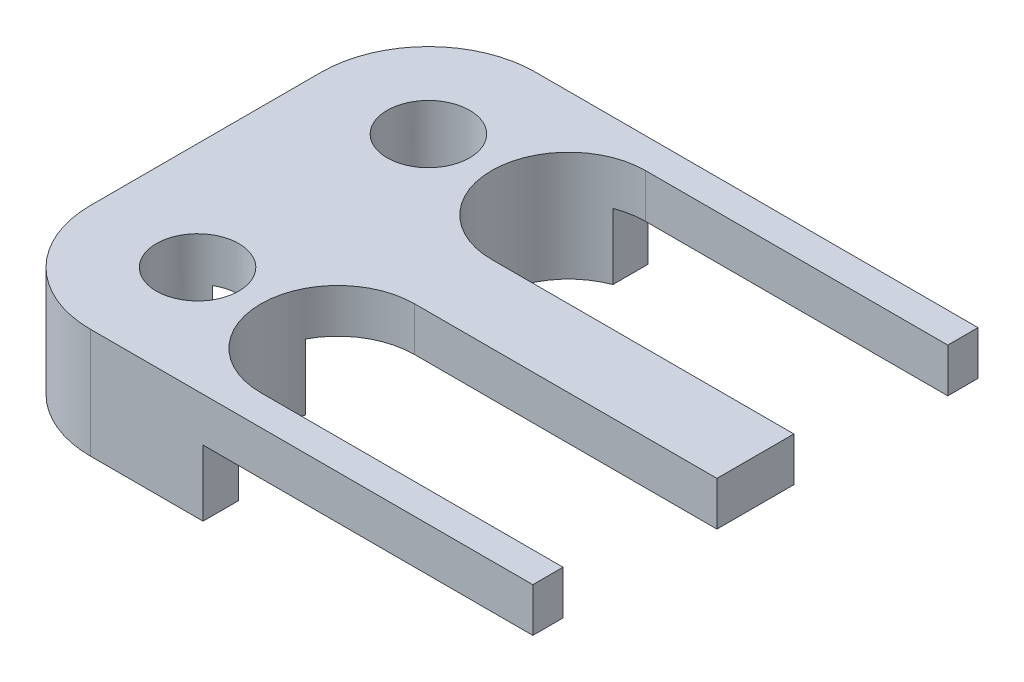
ISO-10303-21;
HEADER;
FILE_DESCRIPTION(('STEP AP214'),'2;1');
FILE_NAME('part.step','',(''),(''),'','','');
FILE_SCHEMA(('AUTOMOTIVE_DESIGN { 1 0 10303 214 1 1 1 1 }'));
ENDSEC;
DATA;
#1=APPLICATION_CONTEXT('core data for automotive mechanical design processes');
#2=APPLICATION_PROTOCOL_DEFINITION('international standard','automotive_design',2000,#1);
#3=PRODUCT_CONTEXT('',#1,'mechanical');
#4=PRODUCT('Part','Part','',(#3));
#5=PRODUCT_RELATED_PRODUCT_CATEGORY('part','',(#4));
#6=PRODUCT_DEFINITION_FORMATION('','',#4);
#7=PRODUCT_DEFINITION_CONTEXT('part definition',#1,'design');
#8=PRODUCT_DEFINITION('design','',#6,#7);
#9=PRODUCT_DEFINITION_SHAPE('','',#8);
#10=(LENGTH_UNIT() NAMED_UNIT(*) SI_UNIT(.MILLI.,.METRE.));
#11=(NAMED_UNIT(*) PLANE_ANGLE_UNIT() SI_UNIT($,.RADIAN.));
#12=(NAMED_UNIT(*) SI_UNIT($,.STERADIAN.) SOLID_ANGLE_UNIT());
#13=UNCERTAINTY_MEASURE_WITH_UNIT(LENGTH_MEASURE(1.E-05),#10,'distance_accuracy_value','');
#14=(GEOMETRIC_REPRESENTATION_CONTEXT(3) GLOBAL_UNCERTAINTY_ASSIGNED_CONTEXT((#13)) GLOBAL_UNIT_ASSIGNED_CONTEXT((#10,
#11,#12)) REPRESENTATION_CONTEXT('',''));
#15=CARTESIAN_POINT('',(0.,0.,0.));
#16=DIRECTION('',(0.,0.,1.));
#17=DIRECTION('',(1.,0.,0.));
#18=AXIS2_PLACEMENT_3D('',#15,#16,#17);
#19=CARTESIAN_POINT('',(40.25,6.,20.25));
#20=DIRECTION('',(0.,1.,0.));
#21=DIRECTION('',(0.,0.,1.));
#22=AXIS2_PLACEMENT_3D('',#19,#20,#21);
#23=PLANE('',#22);
#24=DIRECTION('',(-1.,0.,0.));
#25=VECTOR('',#24,1.);
#26=CARTESIAN_POINT('',(40.25,6.,3.5));
#27=LINE('',#26,#25);
#28=CARTESIAN_POINT('',(40.25,6.,3.5));
#29=VERTEX_POINT('',#28);
#30=CARTESIAN_POINT('',(12.75,6.,3.50000000000001));
#31=VERTEX_POINT('',#30);
#32=EDGE_CURVE('E298',#29,#31,#27,.T.);
#33=ORIENTED_EDGE('',*,*,#32,.T.);
#34=CARTESIAN_POINT('',(12.75,6.,10.5));
#35=DIRECTION('',(0.,1.,0.));
#36=DIRECTION('',(0.,0.,1.));
#37=AXIS2_PLACEMENT_3D('',#34,#35,#36);
#38=CIRCLE('',#37,7.);
#39=CARTESIAN_POINT('',(6.55020161618138,6.,7.25));
#40=VERTEX_POINT('',#39);
#41=EDGE_CURVE('E251',#31,#40,#38,.T.);
#42=ORIENTED_EDGE('',*,*,#41,.T.);
#43=DIRECTION('',(1.,0.,0.));
#44=VECTOR('',#43,1.);
#45=CARTESIAN_POINT('',(-9.75000000000001,6.,7.25));
#46=LINE('',#45,#44);
#47=CARTESIAN_POINT('',(1.87082869338697,6.,7.25));
#48=VERTEX_POINT('',#47);
#49=EDGE_CURVE('E320',#48,#40,#46,.T.);
#50=ORIENTED_EDGE('',*,*,#49,.F.);
#51=CARTESIAN_POINT('',(0.,6.,10.5));
#52=DIRECTION('',(0.,1.,0.));
#53=DIRECTION('',(0.,0.,1.));
#54=AXIS2_PLACEMENT_3D('',#51,#52,#53);
#55=CIRCLE('',#54,3.75);
#56=CARTESIAN_POINT('',(-1.87082869338697,6.,7.25));
#57=VERTEX_POINT('',#56);
#58=EDGE_CURVE('E447',#48,#57,#55,.T.);
#59=ORIENTED_EDGE('',*,*,#58,.T.);
#60=CARTESIAN_POINT('',(-9.75000000000001,6.,7.25));
#61=VERTEX_POINT('',#60);
#62=EDGE_CURVE('E315',#61,#57,#46,.T.);
#63=ORIENTED_EDGE('',*,*,#62,.F.);
#64=DIRECTION('',(0.,0.,1.));
#65=VECTOR('',#64,1.);
#66=CARTESIAN_POINT('',(-9.75000000000001,6.,7.25));
#67=LINE('',#66,#65);
#68=CARTESIAN_POINT('',(-9.75000000000002,6.,-7.25));
#69=VERTEX_POINT('',#68);
#70=EDGE_CURVE('E310',#69,#61,#67,.T.);
#71=ORIENTED_EDGE('',*,*,#70,.F.);
#72=DIRECTION('',(1.,0.,0.));
#73=VECTOR('',#72,1.);
#74=CARTESIAN_POINT('',(-9.75000000000002,6.,-7.25));
#75=LINE('',#74,#73);
#76=CARTESIAN_POINT('',(-1.87082869338697,6.,-7.25));
#77=VERTEX_POINT('',#76);
#78=EDGE_CURVE('E321',#69,#77,#75,.T.);
#79=ORIENTED_EDGE('',*,*,#78,.T.);
#80=CARTESIAN_POINT('',(0.,6.,-10.5));
#81=DIRECTION('',(0.,1.,0.));
#82=DIRECTION('',(0.,0.,1.));
#83=AXIS2_PLACEMENT_3D('',#80,#81,#82);
#84=CIRCLE('',#83,3.75);
#85=CARTESIAN_POINT('',(1.87082869338696,6.,-7.25));
#86=VERTEX_POINT('',#85);
#87=EDGE_CURVE('E319',#77,#86,#84,.T.);
#88=ORIENTED_EDGE('',*,*,#87,.T.);
#89=CARTESIAN_POINT('',(6.55020161618138,6.,-7.25));
#90=VERTEX_POINT('',#89);
#91=EDGE_CURVE('E325',#86,#90,#75,.T.);
#92=ORIENTED_EDGE('',*,*,#91,.T.);
#93=CARTESIAN_POINT('',(12.75,6.,-10.5));
#94=DIRECTION('',(0.,1.,0.));
#95=DIRECTION('',(0.,0.,1.));
#96=AXIS2_PLACEMENT_3D('',#93,#94,#95);
#97=CIRCLE('',#96,7.);
#98=CARTESIAN_POINT('',(12.75,6.,-3.50000000000001));
#99=VERTEX_POINT('',#98);
#100=EDGE_CURVE('E59',#90,#99,#97,.T.);
#101=ORIENTED_EDGE('',*,*,#100,.T.);
#102=DIRECTION('',(1.,0.,0.));
#103=VECTOR('',#102,1.);
#104=CARTESIAN_POINT('',(40.25,6.,-3.5));
#105=LINE('',#104,#103);
#106=CARTESIAN_POINT('',(40.25,6.,-3.5));
#107=VERTEX_POINT('',#106);
#108=EDGE_CURVE('E288',#99,#107,#105,.T.);
#109=ORIENTED_EDGE('',*,*,#108,.T.);
#110=DIRECTION('',(0.,0.,-1.));
#111=VECTOR('',#110,1.);
#112=CARTESIAN_POINT('',(40.25,6.,20.25));
#113=LINE('',#112,#111);
#114=EDGE_CURVE('E348',#29,#107,#113,.T.);
#115=ORIENTED_EDGE('',*,*,#114,.F.);
#116=EDGE_LOOP('',(#33,#42,#50,#59,#63,#71,#79,#88,#92,#101,#109,#115));
#117=FACE_BOUND('',#116,.T.);
#118=ADVANCED_FACE('F43',(#117),#23,.F.);
#119=DIRECTION('',(-1.,0.,0.));
#120=VECTOR('',#119,1.);
#121=CARTESIAN_POINT('',(40.25,6.,-17.5));
#122=LINE('',#121,#120);
#123=CARTESIAN_POINT('',(40.25,6.,-17.5));
#124=VERTEX_POINT('',#123);
#125=CARTESIAN_POINT('',(12.75,6.,-17.5));
#126=VERTEX_POINT('',#125);
#127=EDGE_CURVE('E292',#124,#126,#122,.T.);
#128=ORIENTED_EDGE('',*,*,#127,.T.);
#129=CARTESIAN_POINT('',(10.25,6.,-17.038348415311));
#130=VERTEX_POINT('',#129);
#131=EDGE_CURVE('E283',#126,#130,#97,.T.);
#132=ORIENTED_EDGE('',*,*,#131,.T.);
#133=DIRECTION('',(0.,0.,-1.));
#134=VECTOR('',#133,1.);
#135=CARTESIAN_POINT('',(10.25,6.,20.25));
#136=LINE('',#135,#134);
#137=CARTESIAN_POINT('',(10.25,6.,-20.25));
#138=VERTEX_POINT('',#137);
#139=EDGE_CURVE('E336',#130,#138,#136,.T.);
#140=ORIENTED_EDGE('',*,*,#139,.T.);
#141=DIRECTION('',(-1.,0.,0.));
#142=VECTOR('',#141,1.);
#143=CARTESIAN_POINT('',(40.25,6.,-20.25));
#144=LINE('',#143,#142);
#145=CARTESIAN_POINT('',(40.25,6.,-20.25));
#146=VERTEX_POINT('',#145);
#147=EDGE_CURVE('E356',#146,#138,#144,.T.);
#148=ORIENTED_EDGE('',*,*,#147,.F.);
#149=EDGE_CURVE('E341',#124,#146,#113,.T.);
#150=ORIENTED_EDGE('',*,*,#149,.F.);
#151=EDGE_LOOP('',(#128,#132,#140,#148,#150));
#152=FACE_BOUND('',#151,.T.);
#153=ADVANCED_FACE('F556',(#152),#23,.F.);
#154=CARTESIAN_POINT('',(40.25,0.,0.));
#155=DIRECTION('',(1.,0.,0.));
#156=DIRECTION('',(0.,0.,-1.));
#157=AXIS2_PLACEMENT_3D('',#154,#155,#156);
#158=PLANE('',#157);
#159=DIRECTION('',(0.,1.,0.));
#160=VECTOR('',#159,1.);
#161=CARTESIAN_POINT('',(40.25,0.,3.5));
#162=LINE('',#161,#160);
#163=CARTESIAN_POINT('',(40.25,10.,3.5));
#164=VERTEX_POINT('',#163);
#165=EDGE_CURVE('E11',#29,#164,#162,.T.);
#166=ORIENTED_EDGE('',*,*,#165,.F.);
#167=ORIENTED_EDGE('',*,*,#114,.T.);
#168=DIRECTION('',(0.,-1.,0.));
#169=VECTOR('',#168,1.);
#170=CARTESIAN_POINT('',(40.25,0.,-3.5));
#171=LINE('',#170,#169);
#172=CARTESIAN_POINT('',(40.25,10.,-3.5));
#173=VERTEX_POINT('',#172);
#174=EDGE_CURVE('E468',#173,#107,#171,.T.);
#175=ORIENTED_EDGE('',*,*,#174,.F.);
#176=DIRECTION('',(0.,0.,1.));
#177=VECTOR('',#176,1.);
#178=CARTESIAN_POINT('',(40.25,10.,20.25));
#179=LINE('',#178,#177);
#180=EDGE_CURVE('E357',#173,#164,#179,.T.);
#181=ORIENTED_EDGE('',*,*,#180,.T.);
#182=EDGE_LOOP('',(#166,#167,#175,#181));
#183=FACE_BOUND('',#182,.T.);
#184=ADVANCED_FACE('F571',(#183),#158,.T.);
#185=DIRECTION('',(0.,1.,0.));
#186=VECTOR('',#185,1.);
#187=CARTESIAN_POINT('',(40.25,0.,-17.5));
#188=LINE('',#187,#186);
#189=CARTESIAN_POINT('',(40.25,10.,-17.5));
#190=VERTEX_POINT('',#189);
#191=EDGE_CURVE('E471',#124,#190,#188,.T.);
#192=ORIENTED_EDGE('',*,*,#191,.F.);
#193=ORIENTED_EDGE('',*,*,#149,.T.);
#194=DIRECTION('',(0.,1.,0.));
#195=VECTOR('',#194,1.);
#196=CARTESIAN_POINT('',(40.25,10.,-20.25));
#197=LINE('',#196,#195);
#198=CARTESIAN_POINT('',(40.25,10.,-20.25));
#199=VERTEX_POINT('',#198);
#200=EDGE_CURVE('E347',#146,#199,#197,.T.);
#201=ORIENTED_EDGE('',*,*,#200,.T.);
#202=EDGE_CURVE('E352',#199,#190,#179,.T.);
#203=ORIENTED_EDGE('',*,*,#202,.T.);
#204=EDGE_LOOP('',(#192,#193,#201,#203));
#205=FACE_BOUND('',#204,.T.);
#206=ADVANCED_FACE('F605',(#205),#158,.T.);
#207=CARTESIAN_POINT('',(10.25,10.,-20.25));
#208=DIRECTION('',(-1.,0.,0.));
#209=DIRECTION('',(0.,0.,1.));
#210=AXIS2_PLACEMENT_3D('',#207,#208,#209);
#211=PLANE('',#210);
#212=DIRECTION('',(0.,0.,-1.));
#213=VECTOR('',#212,1.);
#214=CARTESIAN_POINT('',(10.25,0.,-20.25));
#215=LINE('',#214,#213);
#216=CARTESIAN_POINT('',(10.25,0.,20.25));
#217=VERTEX_POINT('',#216);
#218=CARTESIAN_POINT('',(10.25,0.,17.038348415311));
#219=VERTEX_POINT('',#218);
#220=EDGE_CURVE('E411',#217,#219,#215,.T.);
#221=ORIENTED_EDGE('',*,*,#220,.T.);
#222=DIRECTION('',(0.,1.,0.));
#223=VECTOR('',#222,1.);
#224=CARTESIAN_POINT('',(10.25,0.,17.038348415311));
#225=LINE('',#224,#223);
#226=CARTESIAN_POINT('',(10.25,6.,17.038348415311));
#227=VERTEX_POINT('',#226);
#228=EDGE_CURVE('E277',#219,#227,#225,.T.);
#229=ORIENTED_EDGE('',*,*,#228,.T.);
#230=CARTESIAN_POINT('',(10.25,6.,20.25));
#231=VERTEX_POINT('',#230);
#232=EDGE_CURVE('E342',#231,#227,#136,.T.);
#233=ORIENTED_EDGE('',*,*,#232,.F.);
#234=DIRECTION('',(0.,-1.,0.));
#235=VECTOR('',#234,1.);
#236=CARTESIAN_POINT('',(10.25,10.,20.25));
#237=LINE('',#236,#235);
#238=EDGE_CURVE('E440',#231,#217,#237,.T.);
#239=ORIENTED_EDGE('',*,*,#238,.T.);
#240=EDGE_LOOP('',(#221,#229,#233,#239));
#241=FACE_BOUND('',#240,.T.);
#242=ADVANCED_FACE('F484',(#241),#211,.F.);
#243=CARTESIAN_POINT('',(0.,0.,10.5));
#244=DIRECTION('',(0.,-1.,0.));
#245=DIRECTION('',(0.,0.,-1.));
#246=AXIS2_PLACEMENT_3D('',#243,#244,#245);
#247=PLANE('',#246);
#248=CARTESIAN_POINT('',(12.75,0.,10.5));
#249=DIRECTION('',(0.,1.,0.));
#250=DIRECTION('',(0.,0.,1.));
#251=AXIS2_PLACEMENT_3D('',#248,#249,#250);
#252=CIRCLE('',#251,7.);
#253=CARTESIAN_POINT('',(6.55020161618138,0.,7.25));
#254=VERTEX_POINT('',#253);
#255=EDGE_CURVE('E67',#254,#219,#252,.T.);
#256=ORIENTED_EDGE('',*,*,#255,.T.);
#257=ORIENTED_EDGE('',*,*,#220,.F.);
#258=DIRECTION('',(1.,0.,0.));
#259=VECTOR('',#258,1.);
#260=CARTESIAN_POINT('',(10.25,0.,20.25));
#261=LINE('',#260,#259);
#262=CARTESIAN_POINT('',(0.,0.,20.25));
#263=VERTEX_POINT('',#262);
#264=EDGE_CURVE('E406',#263,#217,#261,.T.);
#265=ORIENTED_EDGE('',*,*,#264,.F.);
#266=CARTESIAN_POINT('',(0.,0.,10.5));
#267=DIRECTION('',(0.,1.,0.));
#268=DIRECTION('',(0.,0.,-1.));
#269=AXIS2_PLACEMENT_3D('',#266,#267,#268);
#270=CIRCLE('',#269,9.75000000000001);
#271=CARTESIAN_POINT('',(-9.75,0.,10.5));
#272=VERTEX_POINT('',#271);
#273=EDGE_CURVE('E381',#272,#263,#270,.T.);
#274=ORIENTED_EDGE('',*,*,#273,.F.);
#275=DIRECTION('',(0.,0.,1.));
#276=VECTOR('',#275,1.);
#277=CARTESIAN_POINT('',(-9.75,0.,10.5));
#278=LINE('',#277,#276);
#279=CARTESIAN_POINT('',(-9.75000000000001,0.,7.25));
#280=VERTEX_POINT('',#279);
#281=EDGE_CURVE('E421',#280,#272,#278,.T.);
#282=ORIENTED_EDGE('',*,*,#281,.F.);
#283=DIRECTION('',(1.,0.,0.));
#284=VECTOR('',#283,1.);
#285=CARTESIAN_POINT('',(-9.75000000000001,0.,7.25));
#286=LINE('',#285,#284);
#287=CARTESIAN_POINT('',(-1.87082869338697,0.,7.25));
#288=VERTEX_POINT('',#287);
#289=EDGE_CURVE('E330',#280,#288,#286,.T.);
#290=ORIENTED_EDGE('',*,*,#289,.T.);
#291=CARTESIAN_POINT('',(0.,0.,10.5));
#292=DIRECTION('',(0.,1.,0.));
#293=DIRECTION('',(0.,0.,1.));
#294=AXIS2_PLACEMENT_3D('',#291,#292,#293);
#295=CIRCLE('',#294,3.75);
#296=CARTESIAN_POINT('',(1.87082869338697,0.,7.25));
#297=VERTEX_POINT('',#296);
#298=EDGE_CURVE('E368',#288,#297,#295,.T.);
#299=ORIENTED_EDGE('',*,*,#298,.T.);
#300=EDGE_CURVE('E314',#297,#254,#286,.T.);
#301=ORIENTED_EDGE('',*,*,#300,.T.);
#302=EDGE_LOOP('',(#256,#257,#265,#274,#282,#290,#299,#301));
#303=FACE_BOUND('',#302,.T.);
#304=ADVANCED_FACE('F488',(#303),#247,.T.);
#305=ORIENTED_EDGE('',*,*,#139,.F.);
#306=DIRECTION('',(0.,1.,0.));
#307=VECTOR('',#306,1.);
#308=CARTESIAN_POINT('',(10.25,0.,-17.038348415311));
#309=LINE('',#308,#307);
#310=CARTESIAN_POINT('',(10.25,0.,-17.038348415311));
#311=VERTEX_POINT('',#310);
#312=EDGE_CURVE('E284',#130,#311,#309,.F.);
#313=ORIENTED_EDGE('',*,*,#312,.T.);
#314=CARTESIAN_POINT('',(10.25,0.,-20.25));
#315=VERTEX_POINT('',#314);
#316=EDGE_CURVE('E410',#311,#315,#215,.T.);
#317=ORIENTED_EDGE('',*,*,#316,.T.);
#318=DIRECTION('',(0.,-1.,0.));
#319=VECTOR('',#318,1.);
#320=CARTESIAN_POINT('',(10.25,10.,-20.25));
#321=LINE('',#320,#319);
#322=EDGE_CURVE('E436',#138,#315,#321,.T.);
#323=ORIENTED_EDGE('',*,*,#322,.F.);
#324=EDGE_LOOP('',(#305,#313,#317,#323));
#325=FACE_BOUND('',#324,.T.);
#326=ADVANCED_FACE('F548',(#325),#211,.F.);
#327=CARTESIAN_POINT('',(0.,10.,10.5));
#328=DIRECTION('',(0.,-1.,0.));
#329=DIRECTION('',(0.,0.,-1.));
#330=AXIS2_PLACEMENT_3D('',#327,#328,#329);
#331=PLANE('',#330);
#332=CARTESIAN_POINT('',(12.75,10.,10.5));
#333=DIRECTION('',(0.,1.,0.));
#334=DIRECTION('',(0.,0.,1.));
#335=AXIS2_PLACEMENT_3D('',#332,#333,#334);
#336=CIRCLE('',#335,7.);
#337=CARTESIAN_POINT('',(12.75,10.,3.50000000000001));
#338=VERTEX_POINT('',#337);
#339=CARTESIAN_POINT('',(12.75,10.,17.5));
#340=VERTEX_POINT('',#339);
#341=EDGE_CURVE('E229',#338,#340,#336,.T.);
#342=ORIENTED_EDGE('',*,*,#341,.F.);
#343=DIRECTION('',(-1.,0.,0.));
#344=VECTOR('',#343,1.);
#345=CARTESIAN_POINT('',(12.75,10.,3.50000000000001));
#346=LINE('',#345,#344);
#347=EDGE_CURVE('E244',#164,#338,#346,.T.);
#348=ORIENTED_EDGE('',*,*,#347,.F.);
#349=ORIENTED_EDGE('',*,*,#180,.F.);
#350=DIRECTION('',(1.,0.,0.));
#351=VECTOR('',#350,1.);
#352=CARTESIAN_POINT('',(12.75,10.,-3.50000000000001));
#353=LINE('',#352,#351);
#354=CARTESIAN_POINT('',(12.75,10.,-3.50000000000001));
#355=VERTEX_POINT('',#354);
#356=EDGE_CURVE('E264',#355,#173,#353,.T.);
#357=ORIENTED_EDGE('',*,*,#356,.F.);
#358=CARTESIAN_POINT('',(12.75,10.,-10.5));
#359=DIRECTION('',(0.,1.,0.));
#360=DIRECTION('',(0.,0.,-1.));
#361=AXIS2_PLACEMENT_3D('',#358,#359,#360);
#362=CIRCLE('',#361,7.);
#363=CARTESIAN_POINT('',(12.75,10.,-17.5));
#364=VERTEX_POINT('',#363);
#365=EDGE_CURVE('E236',#364,#355,#362,.T.);
#366=ORIENTED_EDGE('',*,*,#365,.F.);
#367=DIRECTION('',(-1.,0.,0.));
#368=VECTOR('',#367,1.);
#369=CARTESIAN_POINT('',(12.75,10.,-17.5));
#370=LINE('',#369,#368);
#371=EDGE_CURVE('E260',#190,#364,#370,.T.);
#372=ORIENTED_EDGE('',*,*,#371,.F.);
#373=ORIENTED_EDGE('',*,*,#202,.F.);
#374=DIRECTION('',(-1.,0.,0.));
#375=VECTOR('',#374,1.);
#376=CARTESIAN_POINT('',(0.,10.,-20.25));
#377=LINE('',#376,#375);
#378=CARTESIAN_POINT('',(0.,10.,-20.25));
#379=VERTEX_POINT('',#378);
#380=EDGE_CURVE('E393',#199,#379,#377,.T.);
#381=ORIENTED_EDGE('',*,*,#380,.T.);
#382=CARTESIAN_POINT('',(0.,10.,-10.5));
#383=DIRECTION('',(0.,1.,0.));
#384=DIRECTION('',(0.,0.,-1.));
#385=AXIS2_PLACEMENT_3D('',#382,#383,#384);
#386=CIRCLE('',#385,9.75000000000001);
#387=CARTESIAN_POINT('',(-9.75000000000001,10.,-10.5));
#388=VERTEX_POINT('',#387);
#389=EDGE_CURVE('E396',#379,#388,#386,.T.);
#390=ORIENTED_EDGE('',*,*,#389,.T.);
#391=DIRECTION('',(0.,0.,1.));
#392=VECTOR('',#391,1.);
#393=CARTESIAN_POINT('',(-9.75,10.,10.5));
#394=LINE('',#393,#392);
#395=CARTESIAN_POINT('',(-9.75,10.,10.5));
#396=VERTEX_POINT('',#395);
#397=EDGE_CURVE('E399',#388,#396,#394,.T.);
#398=ORIENTED_EDGE('',*,*,#397,.T.);
#399=CARTESIAN_POINT('',(0.,10.,10.5));
#400=DIRECTION('',(0.,1.,0.));
#401=DIRECTION('',(0.,0.,-1.));
#402=AXIS2_PLACEMENT_3D('',#399,#400,#401);
#403=CIRCLE('',#402,9.75000000000001);
#404=CARTESIAN_POINT('',(0.,10.,20.25));
#405=VERTEX_POINT('',#404);
#406=EDGE_CURVE('E385',#396,#405,#403,.T.);
#407=ORIENTED_EDGE('',*,*,#406,.T.);
#408=DIRECTION('',(1.,0.,0.));
#409=VECTOR('',#408,1.);
#410=CARTESIAN_POINT('',(10.25,10.,20.25));
#411=LINE('',#410,#409);
#412=CARTESIAN_POINT('',(40.25,10.,20.25));
#413=VERTEX_POINT('',#412);
#414=EDGE_CURVE('E389',#405,#413,#411,.T.);
#415=ORIENTED_EDGE('',*,*,#414,.T.);
#416=CARTESIAN_POINT('',(40.25,10.,17.5));
#417=VERTEX_POINT('',#416);
#418=EDGE_CURVE('E242',#417,#413,#179,.T.);
#419=ORIENTED_EDGE('',*,*,#418,.F.);
#420=DIRECTION('',(1.,0.,0.));
#421=VECTOR('',#420,1.);
#422=CARTESIAN_POINT('',(12.75,10.,17.5));
#423=LINE('',#422,#421);
#424=EDGE_CURVE('E220',#340,#417,#423,.T.);
#425=ORIENTED_EDGE('',*,*,#424,.F.);
#426=EDGE_LOOP('',(#342,#348,#349,#357,#366,#372,#373,#381,#390,#398,#407,#415,#419,#425));
#427=FACE_BOUND('',#426,.T.);
#428=CARTESIAN_POINT('',(0.,10.,-10.5));
#429=DIRECTION('',(0.,1.,0.));
#430=DIRECTION('',(0.,0.,1.));
#431=AXIS2_PLACEMENT_3D('',#428,#429,#430);
#432=CIRCLE('',#431,3.75);
#433=CARTESIAN_POINT('',(0.,10.,-6.75));
#434=VERTEX_POINT('',#433);
#435=EDGE_CURVE('E377',#434,#434,#432,.T.);
#436=ORIENTED_EDGE('',*,*,#435,.F.);
#437=EDGE_LOOP('',(#436));
#438=FACE_BOUND('',#437,.T.);
#439=CARTESIAN_POINT('',(0.,10.,10.5));
#440=DIRECTION('',(0.,1.,0.));
#441=DIRECTION('',(0.,0.,1.));
#442=AXIS2_PLACEMENT_3D('',#439,#440,#441);
#443=CIRCLE('',#442,3.75);
#444=CARTESIAN_POINT('',(0.,10.,14.25));
#445=VERTEX_POINT('',#444);
#446=EDGE_CURVE('E369',#445,#445,#443,.T.);
#447=ORIENTED_EDGE('',*,*,#446,.F.);
#448=EDGE_LOOP('',(#447));
#449=FACE_BOUND('',#448,.T.);
#450=ADVANCED_FACE('F239',(#427,#438,#449),#331,.F.);
#451=CARTESIAN_POINT('',(12.75,0.,-10.5));
#452=DIRECTION('',(0.,1.,0.));
#453=DIRECTION('',(0.,0.,-1.));
#454=AXIS2_PLACEMENT_3D('',#451,#452,#453);
#455=CIRCLE('',#454,7.);
#456=CARTESIAN_POINT('',(6.55020161618138,0.,-7.25));
#457=VERTEX_POINT('',#456);
#458=EDGE_CURVE('E256',#311,#457,#455,.T.);
#459=ORIENTED_EDGE('',*,*,#458,.T.);
#460=DIRECTION('',(1.,0.,0.));
#461=VECTOR('',#460,1.);
#462=CARTESIAN_POINT('',(-9.75000000000002,0.,-7.25));
#463=LINE('',#462,#461);
#464=CARTESIAN_POINT('',(1.87082869338697,0.,-7.25));
#465=VERTEX_POINT('',#464);
#466=EDGE_CURVE('E329',#465,#457,#463,.T.);
#467=ORIENTED_EDGE('',*,*,#466,.F.);
#468=CARTESIAN_POINT('',(0.,0.,-10.5));
#469=DIRECTION('',(0.,1.,0.));
#470=DIRECTION('',(0.,0.,1.));
#471=AXIS2_PLACEMENT_3D('',#468,#469,#470);
#472=CIRCLE('',#471,3.75);
#473=CARTESIAN_POINT('',(-1.87082869338697,0.,-7.25));
#474=VERTEX_POINT('',#473);
#475=EDGE_CURVE('E373',#465,#474,#472,.T.);
#476=ORIENTED_EDGE('',*,*,#475,.T.);
#477=CARTESIAN_POINT('',(-9.75000000000002,0.,-7.25));
#478=VERTEX_POINT('',#477);
#479=EDGE_CURVE('E326',#478,#474,#463,.T.);
#480=ORIENTED_EDGE('',*,*,#479,.F.);
#481=CARTESIAN_POINT('',(-9.75000000000001,0.,-10.5));
#482=VERTEX_POINT('',#481);
#483=EDGE_CURVE('E390',#482,#478,#278,.T.);
#484=ORIENTED_EDGE('',*,*,#483,.F.);
#485=CARTESIAN_POINT('',(0.,0.,-10.5));
#486=DIRECTION('',(0.,1.,0.));
#487=DIRECTION('',(0.,0.,-1.));
#488=AXIS2_PLACEMENT_3D('',#485,#486,#487);
#489=CIRCLE('',#488,9.75000000000001);
#490=CARTESIAN_POINT('',(0.,0.,-20.25));
#491=VERTEX_POINT('',#490);
#492=EDGE_CURVE('E418',#491,#482,#489,.T.);
#493=ORIENTED_EDGE('',*,*,#492,.F.);
#494=DIRECTION('',(-1.,0.,0.));
#495=VECTOR('',#494,1.);
#496=CARTESIAN_POINT('',(0.,0.,-20.25));
#497=LINE('',#496,#495);
#498=EDGE_CURVE('E415',#315,#491,#497,.T.);
#499=ORIENTED_EDGE('',*,*,#498,.F.);
#500=ORIENTED_EDGE('',*,*,#316,.F.);
#501=EDGE_LOOP('',(#459,#467,#476,#480,#484,#493,#499,#500));
#502=FACE_BOUND('',#501,.T.);
#503=ADVANCED_FACE('F526',(#502),#247,.T.);
#504=CARTESIAN_POINT('',(0.,10.,10.5));
#505=DIRECTION('',(0.,-1.,0.));
#506=DIRECTION('',(0.,0.,-1.));
#507=AXIS2_PLACEMENT_3D('',#504,#505,#506);
#508=CYLINDRICAL_SURFACE('',#507,9.75000000000001);
#509=ORIENTED_EDGE('',*,*,#273,.T.);
#510=DIRECTION('',(0.,-1.,0.));
#511=VECTOR('',#510,1.);
#512=CARTESIAN_POINT('',(0.,10.,20.25));
#513=LINE('',#512,#511);
#514=EDGE_CURVE('E443',#405,#263,#513,.T.);
#515=ORIENTED_EDGE('',*,*,#514,.F.);
#516=ORIENTED_EDGE('',*,*,#406,.F.);
#517=DIRECTION('',(0.,-1.,0.));
#518=VECTOR('',#517,1.);
#519=CARTESIAN_POINT('',(-9.75,10.,10.5));
#520=LINE('',#519,#518);
#521=EDGE_CURVE('E402',#396,#272,#520,.T.);
#522=ORIENTED_EDGE('',*,*,#521,.T.);
#523=EDGE_LOOP('',(#509,#515,#516,#522));
#524=FACE_BOUND('',#523,.T.);
#525=ADVANCED_FACE('F45',(#524),#508,.T.);
#526=CARTESIAN_POINT('',(10.25,10.,20.25));
#527=DIRECTION('',(0.,0.,-1.));
#528=DIRECTION('',(-1.,0.,0.));
#529=AXIS2_PLACEMENT_3D('',#526,#527,#528);
#530=PLANE('',#529);
#531=ORIENTED_EDGE('',*,*,#264,.T.);
#532=ORIENTED_EDGE('',*,*,#238,.F.);
#533=DIRECTION('',(-1.,0.,0.));
#534=VECTOR('',#533,1.);
#535=CARTESIAN_POINT('',(40.25,6.,20.25));
#536=LINE('',#535,#534);
#537=CARTESIAN_POINT('',(40.25,6.,20.25));
#538=VERTEX_POINT('',#537);
#539=EDGE_CURVE('E364',#538,#231,#536,.T.);
#540=ORIENTED_EDGE('',*,*,#539,.F.);
#541=DIRECTION('',(0.,-1.,0.));
#542=VECTOR('',#541,1.);
#543=CARTESIAN_POINT('',(40.25,10.,20.25));
#544=LINE('',#543,#542);
#545=EDGE_CURVE('E337',#413,#538,#544,.T.);
#546=ORIENTED_EDGE('',*,*,#545,.F.);
#547=ORIENTED_EDGE('',*,*,#414,.F.);
#548=ORIENTED_EDGE('',*,*,#514,.T.);
#549=EDGE_LOOP('',(#531,#532,#540,#546,#547,#548));
#550=FACE_BOUND('',#549,.T.);
#551=ADVANCED_FACE('F482',(#550),#530,.F.);
#552=CARTESIAN_POINT('',(0.,10.,-20.25));
#553=DIRECTION('',(0.,0.,1.));
#554=DIRECTION('',(1.,0.,0.));
#555=AXIS2_PLACEMENT_3D('',#552,#553,#554);
#556=PLANE('',#555);
#557=ORIENTED_EDGE('',*,*,#498,.T.);
#558=DIRECTION('',(0.,-1.,0.));
#559=VECTOR('',#558,1.);
#560=CARTESIAN_POINT('',(0.,10.,-20.25));
#561=LINE('',#560,#559);
#562=EDGE_CURVE('E432',#379,#491,#561,.T.);
#563=ORIENTED_EDGE('',*,*,#562,.F.);
#564=ORIENTED_EDGE('',*,*,#380,.F.);
#565=ORIENTED_EDGE('',*,*,#200,.F.);
#566=ORIENTED_EDGE('',*,*,#147,.T.);
#567=ORIENTED_EDGE('',*,*,#322,.T.);
#568=EDGE_LOOP('',(#557,#563,#564,#565,#566,#567));
#569=FACE_BOUND('',#568,.T.);
#570=ADVANCED_FACE('F550',(#569),#556,.F.);
#571=CARTESIAN_POINT('',(0.,10.,-10.5));
#572=DIRECTION('',(0.,-1.,0.));
#573=DIRECTION('',(0.,0.,-1.));
#574=AXIS2_PLACEMENT_3D('',#571,#572,#573);
#575=CYLINDRICAL_SURFACE('',#574,9.75000000000001);
#576=ORIENTED_EDGE('',*,*,#492,.T.);
#577=DIRECTION('',(0.,-1.,0.));
#578=VECTOR('',#577,1.);
#579=CARTESIAN_POINT('',(-9.75000000000001,10.,-10.5));
#580=LINE('',#579,#578);
#581=EDGE_CURVE('E428',#388,#482,#580,.T.);
#582=ORIENTED_EDGE('',*,*,#581,.F.);
#583=ORIENTED_EDGE('',*,*,#389,.F.);
#584=ORIENTED_EDGE('',*,*,#562,.T.);
#585=EDGE_LOOP('',(#576,#582,#583,#584));
#586=FACE_BOUND('',#585,.T.);
#587=ADVANCED_FACE('F617',(#586),#575,.T.);
#588=CARTESIAN_POINT('',(-9.75,10.,10.5));
#589=DIRECTION('',(1.,0.,0.));
#590=DIRECTION('',(0.,0.,-1.));
#591=AXIS2_PLACEMENT_3D('',#588,#589,#590);
#592=PLANE('',#591);
#593=ORIENTED_EDGE('',*,*,#70,.T.);
#594=DIRECTION('',(0.,-1.,0.));
#595=VECTOR('',#594,1.);
#596=CARTESIAN_POINT('',(-9.75000000000001,0.,7.25));
#597=LINE('',#596,#595);
#598=EDGE_CURVE('E302',#61,#280,#597,.T.);
#599=ORIENTED_EDGE('',*,*,#598,.T.);
#600=ORIENTED_EDGE('',*,*,#281,.T.);
#601=ORIENTED_EDGE('',*,*,#521,.F.);
#602=ORIENTED_EDGE('',*,*,#397,.F.);
#603=ORIENTED_EDGE('',*,*,#581,.T.);
#604=ORIENTED_EDGE('',*,*,#483,.T.);
#605=DIRECTION('',(0.,1.,0.));
#606=VECTOR('',#605,1.);
#607=CARTESIAN_POINT('',(-9.75000000000002,0.,-7.25));
#608=LINE('',#607,#606);
#609=EDGE_CURVE('E306',#478,#69,#608,.T.);
#610=ORIENTED_EDGE('',*,*,#609,.T.);
#611=EDGE_LOOP('',(#593,#599,#600,#601,#602,#603,#604,#610));
#612=FACE_BOUND('',#611,.T.);
#613=ADVANCED_FACE('F512',(#612),#592,.F.);
#614=CARTESIAN_POINT('',(0.,10.,-10.5));
#615=DIRECTION('',(0.,-1.,0.));
#616=DIRECTION('',(0.,0.,-1.));
#617=AXIS2_PLACEMENT_3D('',#614,#615,#616);
#618=CYLINDRICAL_SURFACE('',#617,3.75);
#619=DIRECTION('',(0.,-1.,0.));
#620=VECTOR('',#619,1.);
#621=CARTESIAN_POINT('',(1.87082869338696,10.,-7.25));
#622=LINE('',#621,#620);
#623=EDGE_CURVE('E459',#86,#465,#622,.T.);
#624=ORIENTED_EDGE('',*,*,#623,.F.);
#625=ORIENTED_EDGE('',*,*,#87,.F.);
#626=DIRECTION('',(0.,-1.,0.));
#627=VECTOR('',#626,1.);
#628=CARTESIAN_POINT('',(-1.87082869338697,10.,-7.25));
#629=LINE('',#628,#627);
#630=EDGE_CURVE('E456',#474,#77,#629,.F.);
#631=ORIENTED_EDGE('',*,*,#630,.F.);
#632=ORIENTED_EDGE('',*,*,#475,.F.);
#633=EDGE_LOOP('',(#624,#625,#631,#632));
#634=FACE_BOUND('',#633,.T.);
#635=ORIENTED_EDGE('',*,*,#435,.T.);
#636=EDGE_LOOP('',(#635));
#637=FACE_BOUND('',#636,.T.);
#638=ADVANCED_FACE('F536',(#634,#637),#618,.F.);
#639=CARTESIAN_POINT('',(0.,10.,10.5));
#640=DIRECTION('',(0.,-1.,0.));
#641=DIRECTION('',(0.,0.,-1.));
#642=AXIS2_PLACEMENT_3D('',#639,#640,#641);
#643=CYLINDRICAL_SURFACE('',#642,3.75);
#644=DIRECTION('',(0.,-1.,0.));
#645=VECTOR('',#644,1.);
#646=CARTESIAN_POINT('',(-1.87082869338697,10.,7.25));
#647=LINE('',#646,#645);
#648=EDGE_CURVE('E453',#57,#288,#647,.T.);
#649=ORIENTED_EDGE('',*,*,#648,.F.);
#650=ORIENTED_EDGE('',*,*,#58,.F.);
#651=DIRECTION('',(0.,-1.,0.));
#652=VECTOR('',#651,1.);
#653=CARTESIAN_POINT('',(1.87082869338697,10.,7.25));
#654=LINE('',#653,#652);
#655=EDGE_CURVE('E450',#297,#48,#654,.F.);
#656=ORIENTED_EDGE('',*,*,#655,.F.);
#657=ORIENTED_EDGE('',*,*,#298,.F.);
#658=EDGE_LOOP('',(#649,#650,#656,#657));
#659=FACE_BOUND('',#658,.T.);
#660=ORIENTED_EDGE('',*,*,#446,.T.);
#661=EDGE_LOOP('',(#660));
#662=FACE_BOUND('',#661,.T.);
#663=ADVANCED_FACE('F582',(#659,#662),#643,.F.);
#664=ORIENTED_EDGE('',*,*,#232,.T.);
#665=CARTESIAN_POINT('',(12.75,6.,17.5));
#666=VERTEX_POINT('',#665);
#667=EDGE_CURVE('E276',#227,#666,#38,.T.);
#668=ORIENTED_EDGE('',*,*,#667,.T.);
#669=DIRECTION('',(1.,0.,0.));
#670=VECTOR('',#669,1.);
#671=CARTESIAN_POINT('',(40.25,6.,17.5));
#672=LINE('',#671,#670);
#673=CARTESIAN_POINT('',(40.25,6.,17.5));
#674=VERTEX_POINT('',#673);
#675=EDGE_CURVE('E223',#666,#674,#672,.T.);
#676=ORIENTED_EDGE('',*,*,#675,.T.);
#677=EDGE_CURVE('E343',#538,#674,#113,.T.);
#678=ORIENTED_EDGE('',*,*,#677,.F.);
#679=ORIENTED_EDGE('',*,*,#539,.T.);
#680=EDGE_LOOP('',(#664,#668,#676,#678,#679));
#681=FACE_BOUND('',#680,.T.);
#682=ADVANCED_FACE('F476',(#681),#23,.F.);
#683=DIRECTION('',(0.,-1.,0.));
#684=VECTOR('',#683,1.);
#685=CARTESIAN_POINT('',(40.25,0.,17.5));
#686=LINE('',#685,#684);
#687=EDGE_CURVE('E52',#417,#674,#686,.T.);
#688=ORIENTED_EDGE('',*,*,#687,.F.);
#689=ORIENTED_EDGE('',*,*,#418,.T.);
#690=ORIENTED_EDGE('',*,*,#545,.T.);
#691=ORIENTED_EDGE('',*,*,#677,.T.);
#692=EDGE_LOOP('',(#688,#689,#690,#691));
#693=FACE_BOUND('',#692,.T.);
#694=ADVANCED_FACE('F477',(#693),#158,.T.);
#695=CARTESIAN_POINT('',(-9.75000000000002,0.,-7.25));
#696=DIRECTION('',(0.,0.,-1.));
#697=DIRECTION('',(-1.,0.,0.));
#698=AXIS2_PLACEMENT_3D('',#695,#696,#697);
#699=PLANE('',#698);
#700=ORIENTED_EDGE('',*,*,#466,.T.);
#701=DIRECTION('',(0.,1.,0.));
#702=VECTOR('',#701,1.);
#703=CARTESIAN_POINT('',(6.55020161618138,0.,-7.25));
#704=LINE('',#703,#702);
#705=EDGE_CURVE('E465',#457,#90,#704,.T.);
#706=ORIENTED_EDGE('',*,*,#705,.T.);
#707=ORIENTED_EDGE('',*,*,#91,.F.);
#708=ORIENTED_EDGE('',*,*,#623,.T.);
#709=EDGE_LOOP('',(#700,#706,#707,#708));
#710=FACE_BOUND('',#709,.T.);
#711=ADVANCED_FACE('F542',(#710),#699,.F.);
#712=CARTESIAN_POINT('',(-9.75000000000001,0.,7.25));
#713=DIRECTION('',(0.,0.,1.));
#714=DIRECTION('',(1.,0.,0.));
#715=AXIS2_PLACEMENT_3D('',#712,#713,#714);
#716=PLANE('',#715);
#717=ORIENTED_EDGE('',*,*,#648,.T.);
#718=ORIENTED_EDGE('',*,*,#289,.F.);
#719=ORIENTED_EDGE('',*,*,#598,.F.);
#720=ORIENTED_EDGE('',*,*,#62,.T.);
#721=EDGE_LOOP('',(#717,#718,#719,#720));
#722=FACE_BOUND('',#721,.T.);
#723=ADVANCED_FACE('F585',(#722),#716,.F.);
#724=ORIENTED_EDGE('',*,*,#49,.T.);
#725=DIRECTION('',(0.,1.,0.));
#726=VECTOR('',#725,1.);
#727=CARTESIAN_POINT('',(6.55020161618138,0.,7.25));
#728=LINE('',#727,#726);
#729=EDGE_CURVE('E462',#40,#254,#728,.F.);
#730=ORIENTED_EDGE('',*,*,#729,.T.);
#731=ORIENTED_EDGE('',*,*,#300,.F.);
#732=ORIENTED_EDGE('',*,*,#655,.T.);
#733=EDGE_LOOP('',(#724,#730,#731,#732));
#734=FACE_BOUND('',#733,.T.);
#735=ADVANCED_FACE('F577',(#734),#716,.F.);
#736=ORIENTED_EDGE('',*,*,#630,.T.);
#737=ORIENTED_EDGE('',*,*,#78,.F.);
#738=ORIENTED_EDGE('',*,*,#609,.F.);
#739=ORIENTED_EDGE('',*,*,#479,.T.);
#740=EDGE_LOOP('',(#736,#737,#738,#739));
#741=FACE_BOUND('',#740,.T.);
#742=ADVANCED_FACE('F532',(#741),#699,.F.);
#743=CARTESIAN_POINT('',(12.75,0.,3.50000000000001));
#744=DIRECTION('',(0.,0.,-1.));
#745=DIRECTION('',(-1.,0.,0.));
#746=AXIS2_PLACEMENT_3D('',#743,#744,#745);
#747=PLANE('',#746);
#748=ORIENTED_EDGE('',*,*,#165,.T.);
#749=ORIENTED_EDGE('',*,*,#347,.T.);
#750=DIRECTION('',(0.,1.,0.));
#751=VECTOR('',#750,1.);
#752=CARTESIAN_POINT('',(12.75,0.,3.50000000000001));
#753=LINE('',#752,#751);
#754=EDGE_CURVE('E226',#31,#338,#753,.T.);
#755=ORIENTED_EDGE('',*,*,#754,.F.);
#756=ORIENTED_EDGE('',*,*,#32,.F.);
#757=EDGE_LOOP('',(#748,#749,#755,#756));
#758=FACE_BOUND('',#757,.T.);
#759=ADVANCED_FACE('F573',(#758),#747,.F.);
#760=CARTESIAN_POINT('',(12.75,0.,17.5));
#761=DIRECTION('',(0.,0.,1.));
#762=DIRECTION('',(1.,0.,0.));
#763=AXIS2_PLACEMENT_3D('',#760,#761,#762);
#764=PLANE('',#763);
#765=DIRECTION('',(0.,1.,0.));
#766=VECTOR('',#765,1.);
#767=CARTESIAN_POINT('',(12.75,0.,17.5));
#768=LINE('',#767,#766);
#769=EDGE_CURVE('E216',#666,#340,#768,.T.);
#770=ORIENTED_EDGE('',*,*,#769,.T.);
#771=ORIENTED_EDGE('',*,*,#424,.T.);
#772=ORIENTED_EDGE('',*,*,#687,.T.);
#773=ORIENTED_EDGE('',*,*,#675,.F.);
#774=EDGE_LOOP('',(#770,#771,#772,#773));
#775=FACE_BOUND('',#774,.T.);
#776=ADVANCED_FACE('F218',(#775),#764,.F.);
#777=CARTESIAN_POINT('',(12.75,0.,10.5));
#778=DIRECTION('',(0.,1.,0.));
#779=DIRECTION('',(0.,0.,1.));
#780=AXIS2_PLACEMENT_3D('',#777,#778,#779);
#781=CYLINDRICAL_SURFACE('',#780,7.);
#782=ORIENTED_EDGE('',*,*,#255,.F.);
#783=ORIENTED_EDGE('',*,*,#729,.F.);
#784=ORIENTED_EDGE('',*,*,#41,.F.);
#785=ORIENTED_EDGE('',*,*,#754,.T.);
#786=ORIENTED_EDGE('',*,*,#341,.T.);
#787=ORIENTED_EDGE('',*,*,#769,.F.);
#788=ORIENTED_EDGE('',*,*,#667,.F.);
#789=ORIENTED_EDGE('',*,*,#228,.F.);
#790=EDGE_LOOP('',(#782,#783,#784,#785,#786,#787,#788,#789));
#791=FACE_BOUND('',#790,.T.);
#792=ADVANCED_FACE('F230',(#791),#781,.F.);
#793=CARTESIAN_POINT('',(12.75,0.,-17.5));
#794=DIRECTION('',(0.,0.,-1.));
#795=DIRECTION('',(-1.,0.,0.));
#796=AXIS2_PLACEMENT_3D('',#793,#794,#795);
#797=PLANE('',#796);
#798=ORIENTED_EDGE('',*,*,#191,.T.);
#799=ORIENTED_EDGE('',*,*,#371,.T.);
#800=DIRECTION('',(0.,1.,0.));
#801=VECTOR('',#800,1.);
#802=CARTESIAN_POINT('',(12.75,0.,-17.5));
#803=LINE('',#802,#801);
#804=EDGE_CURVE('E257',#126,#364,#803,.T.);
#805=ORIENTED_EDGE('',*,*,#804,.F.);
#806=ORIENTED_EDGE('',*,*,#127,.F.);
#807=EDGE_LOOP('',(#798,#799,#805,#806));
#808=FACE_BOUND('',#807,.T.);
#809=ADVANCED_FACE('F559',(#808),#797,.F.);
#810=CARTESIAN_POINT('',(12.75,0.,-3.50000000000001));
#811=DIRECTION('',(0.,0.,1.));
#812=DIRECTION('',(1.,0.,0.));
#813=AXIS2_PLACEMENT_3D('',#810,#811,#812);
#814=PLANE('',#813);
#815=DIRECTION('',(0.,1.,0.));
#816=VECTOR('',#815,1.);
#817=CARTESIAN_POINT('',(12.75,0.,-3.50000000000001));
#818=LINE('',#817,#816);
#819=EDGE_CURVE('E253',#99,#355,#818,.T.);
#820=ORIENTED_EDGE('',*,*,#819,.T.);
#821=ORIENTED_EDGE('',*,*,#356,.T.);
#822=ORIENTED_EDGE('',*,*,#174,.T.);
#823=ORIENTED_EDGE('',*,*,#108,.F.);
#824=EDGE_LOOP('',(#820,#821,#822,#823));
#825=FACE_BOUND('',#824,.T.);
#826=ADVANCED_FACE('F840',(#825),#814,.F.);
#827=CARTESIAN_POINT('',(12.75,0.,-10.5));
#828=DIRECTION('',(0.,1.,0.));
#829=DIRECTION('',(0.,0.,1.));
#830=AXIS2_PLACEMENT_3D('',#827,#828,#829);
#831=CYLINDRICAL_SURFACE('',#830,7.);
#832=ORIENTED_EDGE('',*,*,#131,.F.);
#833=ORIENTED_EDGE('',*,*,#804,.T.);
#834=ORIENTED_EDGE('',*,*,#365,.T.);
#835=ORIENTED_EDGE('',*,*,#819,.F.);
#836=ORIENTED_EDGE('',*,*,#100,.F.);
#837=ORIENTED_EDGE('',*,*,#705,.F.);
#838=ORIENTED_EDGE('',*,*,#458,.F.);
#839=ORIENTED_EDGE('',*,*,#312,.F.);
#840=EDGE_LOOP('',(#832,#833,#834,#835,#836,#837,#838,#839));
#841=FACE_BOUND('',#840,.T.);
#842=ADVANCED_FACE('F543',(#841),#831,.F.);
#843=CLOSED_SHELL('',(#118,#153,#184,#206,#242,#304,#326,#450,#503,#525,#551,#570,#587,#613,
#638,#663,#682,#694,#711,#723,#735,#742,#759,#776,#792,#809,#826,#842));
#844=MANIFOLD_SOLID_BREP('B2',#843);
#845=ADVANCED_BREP_SHAPE_REPRESENTATION('',(#18,#844),#14);
#846=SHAPE_DEFINITION_REPRESENTATION(#9,#845);
ENDSEC;
END-ISO-10303-21;
